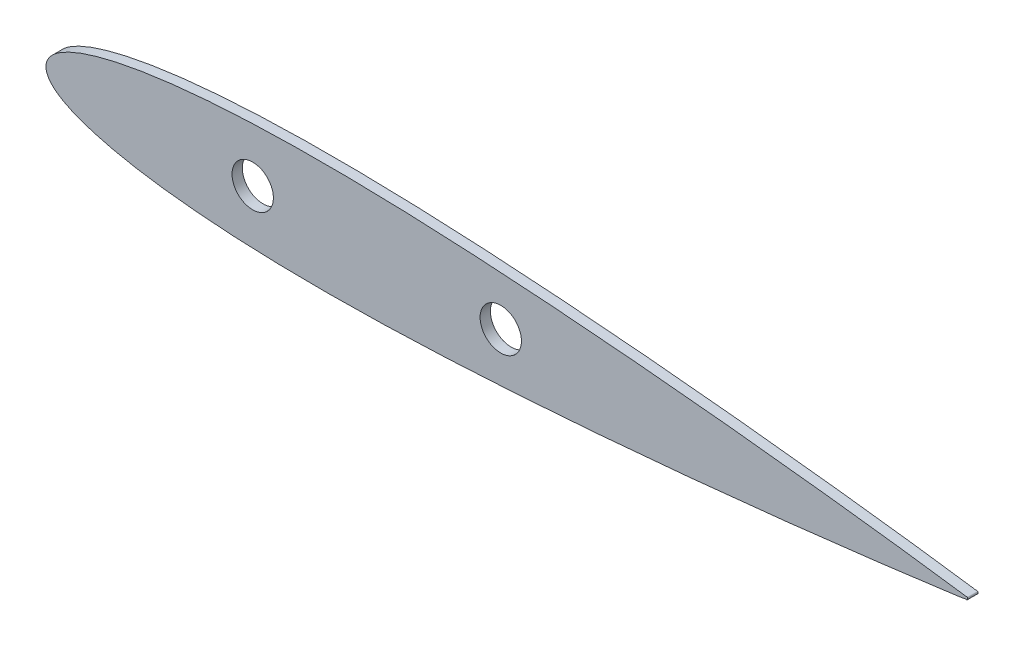
ISO-10303-21;
HEADER;
FILE_DESCRIPTION(('STEP AP214'),'2;1');
FILE_NAME('part.step','',(''),(''),'','','');
FILE_SCHEMA(('AUTOMOTIVE_DESIGN { 1 0 10303 214 1 1 1 1 }'));
ENDSEC;
DATA;
#1=APPLICATION_CONTEXT('core data for automotive mechanical design processes');
#2=APPLICATION_PROTOCOL_DEFINITION('international standard','automotive_design',2000,#1);
#3=PRODUCT_CONTEXT('',#1,'mechanical');
#4=PRODUCT('Part','Part','',(#3));
#5=PRODUCT_RELATED_PRODUCT_CATEGORY('part','',(#4));
#6=PRODUCT_DEFINITION_FORMATION('','',#4);
#7=PRODUCT_DEFINITION_CONTEXT('part definition',#1,'design');
#8=PRODUCT_DEFINITION('design','',#6,#7);
#9=PRODUCT_DEFINITION_SHAPE('','',#8);
#10=(LENGTH_UNIT() NAMED_UNIT(*) SI_UNIT(.MILLI.,.METRE.));
#11=(NAMED_UNIT(*) PLANE_ANGLE_UNIT() SI_UNIT($,.RADIAN.));
#12=(NAMED_UNIT(*) SI_UNIT($,.STERADIAN.) SOLID_ANGLE_UNIT());
#13=UNCERTAINTY_MEASURE_WITH_UNIT(LENGTH_MEASURE(1.E-05),#10,'distance_accuracy_value','');
#14=(GEOMETRIC_REPRESENTATION_CONTEXT(3) GLOBAL_UNCERTAINTY_ASSIGNED_CONTEXT((#13)) GLOBAL_UNIT_ASSIGNED_CONTEXT((#10,
#11,#12)) REPRESENTATION_CONTEXT('',''));
#15=CARTESIAN_POINT('',(0.,0.,0.));
#16=DIRECTION('',(0.,0.,1.));
#17=DIRECTION('',(1.,0.,0.));
#18=AXIS2_PLACEMENT_3D('',#15,#16,#17);
#19=CARTESIAN_POINT('',(283.0068,0.356588568,-3.175));
#20=CARTESIAN_POINT('',(282.901747418678,0.444624050301992,-3.175));
#21=CARTESIAN_POINT('',(282.222988767865,0.3615014960626,-3.175));
#22=CARTESIAN_POINT('',(281.01429283437,0.701750534516606,-3.175));
#23=CARTESIAN_POINT('',(278.797705315382,0.91205553399054,-3.175));
#24=CARTESIAN_POINT('',(275.81162525209,1.36339591692254,-3.175));
#25=CARTESIAN_POINT('',(271.965106870079,1.86706155642296,-3.175));
#26=CARTESIAN_POINT('',(267.326448481132,2.48780640137208,-3.175));
#27=CARTESIAN_POINT('',(261.907718596195,3.18949938217698,-3.175));
#28=CARTESIAN_POINT('',(255.748156547922,3.97074363183848,-3.175));
#29=CARTESIAN_POINT('',(248.883761402343,4.81785288164083,-3.175));
#30=CARTESIAN_POINT('',(241.357474345944,5.71936284445241,-3.175));
#31=CARTESIAN_POINT('',(233.215556988244,6.6640921031586,-3.175));
#32=CARTESIAN_POINT('',(224.508147533236,7.63917842608086,-3.175));
#33=CARTESIAN_POINT('',(215.288960535094,8.63271679355467,-3.175));
#34=CARTESIAN_POINT('',(205.614900546193,9.63236733325325,-3.175));
#35=CARTESIAN_POINT('',(195.545587828168,10.6252270132324,-3.175));
#36=CARTESIAN_POINT('',(185.143130495379,11.5973590661163,-3.175));
#37=CARTESIAN_POINT('',(174.471591386925,12.5360014041284,-3.175));
#38=CARTESIAN_POINT('',(163.596880751837,13.4254616073827,-3.175));
#39=CARTESIAN_POINT('',(152.585818930633,14.2512369917651,-3.175));
#40=CARTESIAN_POINT('',(141.506392817075,14.9979963783924,-3.175));
#41=CARTESIAN_POINT('',(130.426867174905,15.6501256727915,-3.175));
#42=CARTESIAN_POINT('',(119.415450083362,16.1911496504522,-3.175));
#43=CARTESIAN_POINT('',(108.540147702767,16.6066414037154,-3.175));
#44=CARTESIAN_POINT('',(97.867696151851,16.8830460317502,-3.175));
#45=CARTESIAN_POINT('',(87.4640490033789,17.0068628857282,-3.175));
#46=CARTESIAN_POINT('',(77.3931323645915,16.9682658077565,-3.175));
#47=CARTESIAN_POINT('',(67.7170360623935,16.7597994601806,-3.175));
#48=CARTESIAN_POINT('',(58.4953208864843,16.3761794489863,-3.175));
#49=CARTESIAN_POINT('',(49.7847482611922,15.8164022840255,-3.175));
#50=CARTESIAN_POINT('',(41.6388536830569,15.0821522978048,-3.175));
#51=CARTESIAN_POINT('',(34.107484228153,14.1791640141721,-3.175));
#52=CARTESIAN_POINT('',(27.23654600676,13.1151205270069,-3.175));
#53=CARTESIAN_POINT('',(21.0676752424662,11.9011348611113,-3.175));
#54=CARTESIAN_POINT('',(15.6370285356711,10.5509338765086,-3.175));
#55=CARTESIAN_POINT('',(10.975465176974,9.07768371653444,-3.175));
#56=CARTESIAN_POINT('',(7.10666896669025,7.4951056603109,-3.175));
#57=CARTESIAN_POINT('',(4.04297760356957,5.81390659237584,-3.175));
#58=CARTESIAN_POINT('',(1.7891053783873,4.03076834428987,-3.175));
#59=CARTESIAN_POINT('',(0.345518555563984,2.10255274996031,-3.175));
#60=CARTESIAN_POINT('',(-0.161023931568747,0.,-3.175));
#61=CARTESIAN_POINT('',(0.34551855556399,-2.10255274996034,-3.175));
#62=CARTESIAN_POINT('',(1.7891053783873,-4.03076834428986,-3.175));
#63=CARTESIAN_POINT('',(4.04297760356957,-5.81390659237584,-3.175));
#64=CARTESIAN_POINT('',(7.10666896669024,-7.4951056603109,-3.175));
#65=CARTESIAN_POINT('',(10.975465176974,-9.07768371653445,-3.175));
#66=CARTESIAN_POINT('',(15.6370285356711,-10.5509338765086,-3.175));
#67=CARTESIAN_POINT('',(21.0676752424662,-11.9011348611113,-3.175));
#68=CARTESIAN_POINT('',(27.23654600676,-13.1151205270069,-3.175));
#69=CARTESIAN_POINT('',(34.107484228153,-14.1791640141721,-3.175));
#70=CARTESIAN_POINT('',(41.6388536830569,-15.0821522978048,-3.175));
#71=CARTESIAN_POINT('',(49.7847482611922,-15.8164022840255,-3.175));
#72=CARTESIAN_POINT('',(58.4953208864842,-16.3761794489862,-3.175));
#73=CARTESIAN_POINT('',(67.7170360623936,-16.7597994601806,-3.175));
#74=CARTESIAN_POINT('',(77.3931323645915,-16.9682658077565,-3.175));
#75=CARTESIAN_POINT('',(87.4640490033788,-17.0068628857282,-3.175));
#76=CARTESIAN_POINT('',(97.8676961518511,-16.8830460317502,-3.175));
#77=CARTESIAN_POINT('',(108.540147702767,-16.6066414037154,-3.175));
#78=CARTESIAN_POINT('',(119.415450083362,-16.1911496504522,-3.175));
#79=CARTESIAN_POINT('',(130.426867174905,-15.6501256727915,-3.175));
#80=CARTESIAN_POINT('',(141.506392817075,-14.9979963783924,-3.175));
#81=CARTESIAN_POINT('',(152.585818930633,-14.2512369917651,-3.175));
#82=CARTESIAN_POINT('',(163.596880751837,-13.4254616073827,-3.175));
#83=CARTESIAN_POINT('',(174.471591386925,-12.5360014041284,-3.175));
#84=CARTESIAN_POINT('',(185.143130495379,-11.5973590661163,-3.175));
#85=CARTESIAN_POINT('',(195.545587828168,-10.6252270132324,-3.175));
#86=CARTESIAN_POINT('',(205.614900546193,-9.63236733325325,-3.175));
#87=CARTESIAN_POINT('',(215.288960535094,-8.63271679355466,-3.175));
#88=CARTESIAN_POINT('',(224.508147533236,-7.63917842608086,-3.175));
#89=CARTESIAN_POINT('',(233.215556988243,-6.6640921031586,-3.175));
#90=CARTESIAN_POINT('',(241.357474345944,-5.71936284445241,-3.175));
#91=CARTESIAN_POINT('',(248.883761402343,-4.81785288164083,-3.175));
#92=CARTESIAN_POINT('',(255.748156547922,-3.97074363183847,-3.175));
#93=CARTESIAN_POINT('',(261.907718596195,-3.18949938217699,-3.175));
#94=CARTESIAN_POINT('',(267.326448481132,-2.48780640137208,-3.175));
#95=CARTESIAN_POINT('',(271.965106870079,-1.86706155642296,-3.175));
#96=CARTESIAN_POINT('',(275.81162525209,-1.36339591692255,-3.175));
#97=CARTESIAN_POINT('',(278.797705315382,-0.912055533990539,-3.175));
#98=CARTESIAN_POINT('',(281.01429283437,-0.701750534516611,-3.175));
#99=CARTESIAN_POINT('',(282.222988767865,-0.361501496062577,-3.175));
#100=CARTESIAN_POINT('',(283.176929528894,-0.478323569055531,-3.175));
#101=CARTESIAN_POINT('',(283.176929528894,0.214017724508904,-3.175));
#102=CARTESIAN_POINT('',(283.0068,0.356588568,-3.175));
#103=B_SPLINE_CURVE_WITH_KNOTS('',3,(#19,#20,#21,#22,#23,#24,#25,#26,#27,#28,#29,#30,#31,#32,
#33,#34,#35,#36,#37,#38,#39,#40,#41,#42,#43,#44,#45,#46,#47,#48,#49,#50,#51,#52,#53,#54,#55,#56,
#57,#58,#59,#60,#61,#62,#63,#64,#65,#66,#67,#68,#69,#70,#71,#72,#73,#74,#75,#76,#77,#78,#79,#80,
#81,#82,#83,#84,#85,#86,#87,#88,#89,#90,#91,#92,#93,#94,#95,#96,#97,#98,#99,#100,#101,#102),
.UNSPECIFIED.,.T.,.F.,(4,1,1,1,1,1,1,1,1,1,1,1,1,1,1,1,1,1,1,1,1,1,1,1,1,1,1,1,1,1,1,1,1,1,1,1,
1,1,1,1,1,1,1,1,1,1,1,1,1,1,1,1,1,1,1,1,1,1,1,1,1,1,1,1,1,1,1,1,1,1,1,1,1,1,1,1,1,1,1,1,1,4),
(0.,0.00076221456395363,0.00304470622374583,0.00683224554314449,0.0121011756295475,
0.0188175356587402,0.026939454618848,0.0364148482586666,0.0471846284212464,0.0591804130999874,
0.0723278736140799,0.0865440610893101,0.101740580336709,0.117823336433724,0.134691452208465,
0.152240154447291,0.170361289964766,0.188941007849664,0.207865435445754,0.227016078022608,
0.2462756959801,0.265524943249987,0.284644966110528,0.303520118268738,0.322034575374401,
0.340078352914181,0.357542593241757,0.374325481920883,0.390329890871931,0.405463889739132,
0.419643801445716,0.432793371391366,0.444843816743207,0.455737920704751,0.465428653233098,
0.473886320085426,0.481101634077576,0.487101684418683,0.491975368345096,0.49593067780738,
0.499382808099288,0.502834938391196,0.506790247853481,0.511663931779894,0.517663982121001,
0.524879296113151,0.533336962965479,0.543027695493826,0.553921799455369,0.565972244807211,
0.579121814752861,0.593301726459445,0.608435725326646,0.624440134277693,0.641223022956819,
0.658687263284396,0.676731040824176,0.695245497929838,0.714120650088049,0.73324067294859,
0.752489920218477,0.771749538175969,0.790900180752823,0.809824608348913,0.828404326233811,
0.846525461751286,0.864074163990112,0.880942279764853,0.897025035861868,0.912221555109267,
0.926437742584497,0.939585203098589,0.95158098777733,0.96235076793991,0.971826161579729,
0.979948080539837,0.986664440569029,0.991933370655432,0.995720909974831,0.998003401634623,
0.998765616198577,1.),.UNSPECIFIED.);
#104=DIRECTION('',(0.,0.,1.));
#105=VECTOR('',#104,1.);
#106=SURFACE_OF_LINEAR_EXTRUSION('',#103,#105);
#107=CARTESIAN_POINT('',(283.0068,0.356588568,-3.175));
#108=VERTEX_POINT('',#107);
#109=EDGE_CURVE('E10',#108,#108,#103,.T.);
#110=ORIENTED_EDGE('',*,*,#109,.T.);
#111=EDGE_LOOP('',(#110));
#112=FACE_BOUND('',#111,.T.);
#113=CARTESIAN_POINT('',(283.0068,0.356588568,0.));
#114=CARTESIAN_POINT('',(282.901747418678,0.444624050301992,0.));
#115=CARTESIAN_POINT('',(282.222988767865,0.3615014960626,0.));
#116=CARTESIAN_POINT('',(281.01429283437,0.701750534516606,0.));
#117=CARTESIAN_POINT('',(278.797705315382,0.91205553399054,0.));
#118=CARTESIAN_POINT('',(275.81162525209,1.36339591692254,0.));
#119=CARTESIAN_POINT('',(271.965106870079,1.86706155642296,0.));
#120=CARTESIAN_POINT('',(267.326448481132,2.48780640137208,0.));
#121=CARTESIAN_POINT('',(261.907718596195,3.18949938217698,0.));
#122=CARTESIAN_POINT('',(255.748156547922,3.97074363183848,0.));
#123=CARTESIAN_POINT('',(248.883761402343,4.81785288164083,0.));
#124=CARTESIAN_POINT('',(241.357474345944,5.71936284445241,0.));
#125=CARTESIAN_POINT('',(233.215556988244,6.6640921031586,0.));
#126=CARTESIAN_POINT('',(224.508147533236,7.63917842608086,0.));
#127=CARTESIAN_POINT('',(215.288960535094,8.63271679355467,0.));
#128=CARTESIAN_POINT('',(205.614900546193,9.63236733325325,0.));
#129=CARTESIAN_POINT('',(195.545587828168,10.6252270132324,0.));
#130=CARTESIAN_POINT('',(185.143130495379,11.5973590661163,0.));
#131=CARTESIAN_POINT('',(174.471591386925,12.5360014041284,0.));
#132=CARTESIAN_POINT('',(163.596880751837,13.4254616073827,0.));
#133=CARTESIAN_POINT('',(152.585818930633,14.2512369917651,0.));
#134=CARTESIAN_POINT('',(141.506392817075,14.9979963783924,0.));
#135=CARTESIAN_POINT('',(130.426867174905,15.6501256727915,0.));
#136=CARTESIAN_POINT('',(119.415450083362,16.1911496504522,0.));
#137=CARTESIAN_POINT('',(108.540147702767,16.6066414037154,0.));
#138=CARTESIAN_POINT('',(97.867696151851,16.8830460317502,0.));
#139=CARTESIAN_POINT('',(87.4640490033789,17.0068628857282,0.));
#140=CARTESIAN_POINT('',(77.3931323645915,16.9682658077565,0.));
#141=CARTESIAN_POINT('',(67.7170360623935,16.7597994601806,0.));
#142=CARTESIAN_POINT('',(58.4953208864843,16.3761794489863,0.));
#143=CARTESIAN_POINT('',(49.7847482611922,15.8164022840255,0.));
#144=CARTESIAN_POINT('',(41.6388536830569,15.0821522978048,0.));
#145=CARTESIAN_POINT('',(34.107484228153,14.1791640141721,0.));
#146=CARTESIAN_POINT('',(27.23654600676,13.1151205270069,0.));
#147=CARTESIAN_POINT('',(21.0676752424662,11.9011348611113,0.));
#148=CARTESIAN_POINT('',(15.6370285356711,10.5509338765086,0.));
#149=CARTESIAN_POINT('',(10.975465176974,9.07768371653444,0.));
#150=CARTESIAN_POINT('',(7.10666896669025,7.4951056603109,0.));
#151=CARTESIAN_POINT('',(4.04297760356957,5.81390659237584,0.));
#152=CARTESIAN_POINT('',(1.7891053783873,4.03076834428987,0.));
#153=CARTESIAN_POINT('',(0.345518555563984,2.10255274996031,0.));
#154=CARTESIAN_POINT('',(-0.161023931568747,0.,0.));
#155=CARTESIAN_POINT('',(0.34551855556399,-2.10255274996034,0.));
#156=CARTESIAN_POINT('',(1.7891053783873,-4.03076834428986,0.));
#157=CARTESIAN_POINT('',(4.04297760356957,-5.81390659237584,0.));
#158=CARTESIAN_POINT('',(7.10666896669024,-7.4951056603109,0.));
#159=CARTESIAN_POINT('',(10.975465176974,-9.07768371653445,0.));
#160=CARTESIAN_POINT('',(15.6370285356711,-10.5509338765086,0.));
#161=CARTESIAN_POINT('',(21.0676752424662,-11.9011348611113,0.));
#162=CARTESIAN_POINT('',(27.23654600676,-13.1151205270069,0.));
#163=CARTESIAN_POINT('',(34.107484228153,-14.1791640141721,0.));
#164=CARTESIAN_POINT('',(41.6388536830569,-15.0821522978048,0.));
#165=CARTESIAN_POINT('',(49.7847482611922,-15.8164022840255,0.));
#166=CARTESIAN_POINT('',(58.4953208864842,-16.3761794489862,0.));
#167=CARTESIAN_POINT('',(67.7170360623936,-16.7597994601806,0.));
#168=CARTESIAN_POINT('',(77.3931323645915,-16.9682658077565,0.));
#169=CARTESIAN_POINT('',(87.4640490033788,-17.0068628857282,0.));
#170=CARTESIAN_POINT('',(97.8676961518511,-16.8830460317502,0.));
#171=CARTESIAN_POINT('',(108.540147702767,-16.6066414037154,0.));
#172=CARTESIAN_POINT('',(119.415450083362,-16.1911496504522,0.));
#173=CARTESIAN_POINT('',(130.426867174905,-15.6501256727915,0.));
#174=CARTESIAN_POINT('',(141.506392817075,-14.9979963783924,0.));
#175=CARTESIAN_POINT('',(152.585818930633,-14.2512369917651,0.));
#176=CARTESIAN_POINT('',(163.596880751837,-13.4254616073827,0.));
#177=CARTESIAN_POINT('',(174.471591386925,-12.5360014041284,0.));
#178=CARTESIAN_POINT('',(185.143130495379,-11.5973590661163,0.));
#179=CARTESIAN_POINT('',(195.545587828168,-10.6252270132324,0.));
#180=CARTESIAN_POINT('',(205.614900546193,-9.63236733325325,0.));
#181=CARTESIAN_POINT('',(215.288960535094,-8.63271679355466,0.));
#182=CARTESIAN_POINT('',(224.508147533236,-7.63917842608086,0.));
#183=CARTESIAN_POINT('',(233.215556988243,-6.6640921031586,0.));
#184=CARTESIAN_POINT('',(241.357474345944,-5.71936284445241,0.));
#185=CARTESIAN_POINT('',(248.883761402343,-4.81785288164083,0.));
#186=CARTESIAN_POINT('',(255.748156547922,-3.97074363183847,0.));
#187=CARTESIAN_POINT('',(261.907718596195,-3.18949938217699,0.));
#188=CARTESIAN_POINT('',(267.326448481132,-2.48780640137208,0.));
#189=CARTESIAN_POINT('',(271.965106870079,-1.86706155642296,0.));
#190=CARTESIAN_POINT('',(275.81162525209,-1.36339591692255,0.));
#191=CARTESIAN_POINT('',(278.797705315382,-0.912055533990539,0.));
#192=CARTESIAN_POINT('',(281.01429283437,-0.701750534516611,0.));
#193=CARTESIAN_POINT('',(282.222988767865,-0.361501496062577,0.));
#194=CARTESIAN_POINT('',(283.176929528894,-0.478323569055531,0.));
#195=CARTESIAN_POINT('',(283.176929528894,0.214017724508904,0.));
#196=CARTESIAN_POINT('',(283.0068,0.356588568,0.));
#197=B_SPLINE_CURVE_WITH_KNOTS('',3,(#113,#114,#115,#116,#117,#118,#119,#120,#121,#122,#123,
#124,#125,#126,#127,#128,#129,#130,#131,#132,#133,#134,#135,#136,#137,#138,#139,#140,#141,#142,
#143,#144,#145,#146,#147,#148,#149,#150,#151,#152,#153,#154,#155,#156,#157,#158,#159,#160,#161,
#162,#163,#164,#165,#166,#167,#168,#169,#170,#171,#172,#173,#174,#175,#176,#177,#178,#179,#180,
#181,#182,#183,#184,#185,#186,#187,#188,#189,#190,#191,#192,#193,#194,#195,#196),.UNSPECIFIED.,
.T.,.F.,(4,1,1,1,1,1,1,1,1,1,1,1,1,1,1,1,1,1,1,1,1,1,1,1,1,1,1,1,1,1,1,1,1,1,1,1,1,1,1,1,1,1,1,
1,1,1,1,1,1,1,1,1,1,1,1,1,1,1,1,1,1,1,1,1,1,1,1,1,1,1,1,1,1,1,1,1,1,1,1,1,1,4),(0.,
0.00076221456395363,0.00304470622374583,0.00683224554314449,0.0121011756295475,
0.0188175356587402,0.026939454618848,0.0364148482586666,0.0471846284212464,0.0591804130999874,
0.0723278736140799,0.0865440610893101,0.101740580336709,0.117823336433724,0.134691452208465,
0.152240154447291,0.170361289964766,0.188941007849664,0.207865435445754,0.227016078022608,
0.2462756959801,0.265524943249987,0.284644966110528,0.303520118268738,0.322034575374401,
0.340078352914181,0.357542593241757,0.374325481920883,0.390329890871931,0.405463889739132,
0.419643801445716,0.432793371391366,0.444843816743207,0.455737920704751,0.465428653233098,
0.473886320085426,0.481101634077576,0.487101684418683,0.491975368345096,0.49593067780738,
0.499382808099288,0.502834938391196,0.506790247853481,0.511663931779894,0.517663982121001,
0.524879296113151,0.533336962965479,0.543027695493826,0.553921799455369,0.565972244807211,
0.579121814752861,0.593301726459445,0.608435725326646,0.624440134277693,0.641223022956819,
0.658687263284396,0.676731040824176,0.695245497929838,0.714120650088049,0.73324067294859,
0.752489920218477,0.771749538175969,0.790900180752823,0.809824608348913,0.828404326233811,
0.846525461751286,0.864074163990112,0.880942279764853,0.897025035861868,0.912221555109267,
0.926437742584497,0.939585203098589,0.95158098777733,0.96235076793991,0.971826161579729,
0.979948080539837,0.986664440569029,0.991933370655432,0.995720909974831,0.998003401634623,
0.998765616198577,1.),.UNSPECIFIED.);
#198=CARTESIAN_POINT('',(283.0068,0.356588568,0.));
#199=VERTEX_POINT('',#198);
#200=EDGE_CURVE('E39',#199,#199,#197,.T.);
#201=ORIENTED_EDGE('',*,*,#200,.F.);
#202=EDGE_LOOP('',(#201));
#203=FACE_BOUND('',#202,.T.);
#204=ADVANCED_FACE('F35',(#112,#203),#106,.T.);
#205=CARTESIAN_POINT('',(0.0151727268943868,-0.358152364006504,-3.175));
#206=DIRECTION('',(0.,0.,1.));
#207=DIRECTION('',(-1.,0.,0.));
#208=AXIS2_PLACEMENT_3D('',#205,#206,#207);
#209=PLANE('',#208);
#210=CARTESIAN_POINT('',(63.5,0.,-3.175));
#211=DIRECTION('',(0.,0.,1.));
#212=DIRECTION('',(1.,0.,0.));
#213=AXIS2_PLACEMENT_3D('',#210,#211,#212);
#214=CIRCLE('',#213,6.35);
#215=CARTESIAN_POINT('',(69.85,0.,-3.175));
#216=VERTEX_POINT('',#215);
#217=EDGE_CURVE('E61',#216,#216,#214,.T.);
#218=ORIENTED_EDGE('',*,*,#217,.T.);
#219=EDGE_LOOP('',(#218));
#220=FACE_BOUND('',#219,.T.);
#221=CARTESIAN_POINT('',(139.7,0.,-3.175));
#222=DIRECTION('',(0.,0.,1.));
#223=DIRECTION('',(1.,0.,0.));
#224=AXIS2_PLACEMENT_3D('',#221,#222,#223);
#225=CIRCLE('',#224,6.35);
#226=CARTESIAN_POINT('',(146.05,0.,-3.175));
#227=VERTEX_POINT('',#226);
#228=EDGE_CURVE('E52',#227,#227,#225,.T.);
#229=ORIENTED_EDGE('',*,*,#228,.T.);
#230=EDGE_LOOP('',(#229));
#231=FACE_BOUND('',#230,.T.);
#232=ORIENTED_EDGE('',*,*,#109,.F.);
#233=EDGE_LOOP('',(#232));
#234=FACE_BOUND('',#233,.T.);
#235=ADVANCED_FACE('F74',(#220,#231,#234),#209,.F.);
#236=CARTESIAN_POINT('',(0.0151727268943868,-0.358152364006504,0.));
#237=DIRECTION('',(0.,0.,1.));
#238=DIRECTION('',(-1.,0.,0.));
#239=AXIS2_PLACEMENT_3D('',#236,#237,#238);
#240=PLANE('',#239);
#241=CARTESIAN_POINT('',(63.5,0.,0.));
#242=DIRECTION('',(0.,0.,1.));
#243=DIRECTION('',(1.,0.,0.));
#244=AXIS2_PLACEMENT_3D('',#241,#242,#243);
#245=CIRCLE('',#244,6.35);
#246=CARTESIAN_POINT('',(69.85,0.,0.));
#247=VERTEX_POINT('',#246);
#248=EDGE_CURVE('E47',#247,#247,#245,.T.);
#249=ORIENTED_EDGE('',*,*,#248,.F.);
#250=EDGE_LOOP('',(#249));
#251=FACE_BOUND('',#250,.T.);
#252=CARTESIAN_POINT('',(139.7,0.,0.));
#253=DIRECTION('',(0.,0.,1.));
#254=DIRECTION('',(1.,0.,0.));
#255=AXIS2_PLACEMENT_3D('',#252,#253,#254);
#256=CIRCLE('',#255,6.35);
#257=CARTESIAN_POINT('',(146.05,0.,0.));
#258=VERTEX_POINT('',#257);
#259=EDGE_CURVE('E58',#258,#258,#256,.T.);
#260=ORIENTED_EDGE('',*,*,#259,.F.);
#261=EDGE_LOOP('',(#260));
#262=FACE_BOUND('',#261,.T.);
#263=ORIENTED_EDGE('',*,*,#200,.T.);
#264=EDGE_LOOP('',(#263));
#265=FACE_BOUND('',#264,.T.);
#266=ADVANCED_FACE('F70',(#251,#262,#265),#240,.T.);
#267=CARTESIAN_POINT('',(139.7,0.,0.));
#268=DIRECTION('',(0.,0.,-1.));
#269=DIRECTION('',(1.,0.,0.));
#270=AXIS2_PLACEMENT_3D('',#267,#268,#269);
#271=CYLINDRICAL_SURFACE('',#270,6.35);
#272=ORIENTED_EDGE('',*,*,#259,.T.);
#273=EDGE_LOOP('',(#272));
#274=FACE_BOUND('',#273,.T.);
#275=ORIENTED_EDGE('',*,*,#228,.F.);
#276=EDGE_LOOP('',(#275));
#277=FACE_BOUND('',#276,.T.);
#278=ADVANCED_FACE('F73',(#274,#277),#271,.F.);
#279=CARTESIAN_POINT('',(63.5,0.,0.));
#280=DIRECTION('',(0.,0.,-1.));
#281=DIRECTION('',(1.,0.,0.));
#282=AXIS2_PLACEMENT_3D('',#279,#280,#281);
#283=CYLINDRICAL_SURFACE('',#282,6.35);
#284=ORIENTED_EDGE('',*,*,#248,.T.);
#285=EDGE_LOOP('',(#284));
#286=FACE_BOUND('',#285,.T.);
#287=ORIENTED_EDGE('',*,*,#217,.F.);
#288=EDGE_LOOP('',(#287));
#289=FACE_BOUND('',#288,.T.);
#290=ADVANCED_FACE('F67',(#286,#289),#283,.F.);
#291=CLOSED_SHELL('',(#204,#235,#266,#278,#290));
#292=MANIFOLD_SOLID_BREP('B2',#291);
#293=ADVANCED_BREP_SHAPE_REPRESENTATION('',(#18,#292),#14);
#294=SHAPE_DEFINITION_REPRESENTATION(#9,#293);
ENDSEC;
END-ISO-10303-21;
